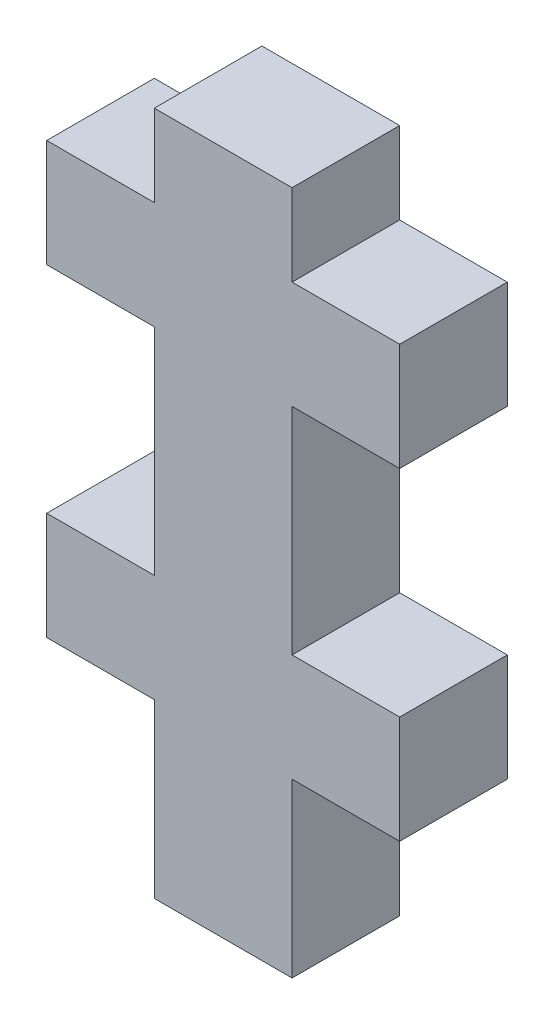
ISO-10303-21;
HEADER;
FILE_DESCRIPTION(('STEP AP214'),'2;1');
FILE_NAME('part.step','',(''),(''),'','','');
FILE_SCHEMA(('AUTOMOTIVE_DESIGN { 1 0 10303 214 1 1 1 1 }'));
ENDSEC;
DATA;
#1=APPLICATION_CONTEXT('core data for automotive mechanical design processes');
#2=APPLICATION_PROTOCOL_DEFINITION('international standard','automotive_design',2000,#1);
#3=PRODUCT_CONTEXT('',#1,'mechanical');
#4=PRODUCT('Part','Part','',(#3));
#5=PRODUCT_RELATED_PRODUCT_CATEGORY('part','',(#4));
#6=PRODUCT_DEFINITION_FORMATION('','',#4);
#7=PRODUCT_DEFINITION_CONTEXT('part definition',#1,'design');
#8=PRODUCT_DEFINITION('design','',#6,#7);
#9=PRODUCT_DEFINITION_SHAPE('','',#8);
#10=(LENGTH_UNIT() NAMED_UNIT(*) SI_UNIT(.MILLI.,.METRE.));
#11=(NAMED_UNIT(*) PLANE_ANGLE_UNIT() SI_UNIT($,.RADIAN.));
#12=(NAMED_UNIT(*) SI_UNIT($,.STERADIAN.) SOLID_ANGLE_UNIT());
#13=UNCERTAINTY_MEASURE_WITH_UNIT(LENGTH_MEASURE(1.E-05),#10,'distance_accuracy_value','');
#14=(GEOMETRIC_REPRESENTATION_CONTEXT(3) GLOBAL_UNCERTAINTY_ASSIGNED_CONTEXT((#13)) GLOBAL_UNIT_ASSIGNED_CONTEXT((#10,
#11,#12)) REPRESENTATION_CONTEXT('',''));
#15=CARTESIAN_POINT('',(0.,0.,0.));
#16=DIRECTION('',(0.,0.,1.));
#17=DIRECTION('',(1.,0.,0.));
#18=AXIS2_PLACEMENT_3D('',#15,#16,#17);
#19=CARTESIAN_POINT('',(0.,7.99999999999999,5.));
#20=DIRECTION('',(1.,0.,0.));
#21=DIRECTION('',(0.,0.,-1.));
#22=AXIS2_PLACEMENT_3D('',#19,#20,#21);
#23=PLANE('',#22);
#24=DIRECTION('',(0.,-1.,0.));
#25=VECTOR('',#24,1.);
#26=CARTESIAN_POINT('',(0.,7.99999999999999,0.));
#27=LINE('',#26,#25);
#28=CARTESIAN_POINT('',(0.,7.99999999999999,0.));
#29=VERTEX_POINT('',#28);
#30=CARTESIAN_POINT('',(0.,0.,0.));
#31=VERTEX_POINT('',#30);
#32=EDGE_CURVE('E200',#29,#31,#27,.T.);
#33=ORIENTED_EDGE('',*,*,#32,.T.);
#34=DIRECTION('',(0.,0.,-1.));
#35=VECTOR('',#34,1.);
#36=CARTESIAN_POINT('',(0.,0.,5.));
#37=LINE('',#36,#35);
#38=CARTESIAN_POINT('',(0.,0.,5.));
#39=VERTEX_POINT('',#38);
#40=EDGE_CURVE('E11',#39,#31,#37,.T.);
#41=ORIENTED_EDGE('',*,*,#40,.F.);
#42=DIRECTION('',(0.,-1.,0.));
#43=VECTOR('',#42,1.);
#44=CARTESIAN_POINT('',(0.,7.99999999999999,5.));
#45=LINE('',#44,#43);
#46=CARTESIAN_POINT('',(0.,7.99999999999999,5.));
#47=VERTEX_POINT('',#46);
#48=EDGE_CURVE('E238',#47,#39,#45,.T.);
#49=ORIENTED_EDGE('',*,*,#48,.F.);
#50=DIRECTION('',(0.,0.,-1.));
#51=VECTOR('',#50,1.);
#52=CARTESIAN_POINT('',(0.,7.99999999999999,5.));
#53=LINE('',#52,#51);
#54=EDGE_CURVE('E196',#47,#29,#53,.T.);
#55=ORIENTED_EDGE('',*,*,#54,.T.);
#56=EDGE_LOOP('',(#33,#41,#49,#55));
#57=FACE_BOUND('',#56,.T.);
#58=ADVANCED_FACE('F32',(#57),#23,.F.);
#59=CARTESIAN_POINT('',(0.,0.,5.));
#60=DIRECTION('',(0.,1.,0.));
#61=DIRECTION('',(0.,0.,1.));
#62=AXIS2_PLACEMENT_3D('',#59,#60,#61);
#63=PLANE('',#62);
#64=DIRECTION('',(1.,0.,0.));
#65=VECTOR('',#64,1.);
#66=CARTESIAN_POINT('',(0.,0.,0.));
#67=LINE('',#66,#65);
#68=CARTESIAN_POINT('',(6.4,0.,0.));
#69=VERTEX_POINT('',#68);
#70=EDGE_CURVE('E203',#31,#69,#67,.T.);
#71=ORIENTED_EDGE('',*,*,#70,.T.);
#72=DIRECTION('',(0.,0.,-1.));
#73=VECTOR('',#72,1.);
#74=CARTESIAN_POINT('',(6.4,0.,5.));
#75=LINE('',#74,#73);
#76=CARTESIAN_POINT('',(6.4,0.,5.));
#77=VERTEX_POINT('',#76);
#78=EDGE_CURVE('E40',#77,#69,#75,.T.);
#79=ORIENTED_EDGE('',*,*,#78,.F.);
#80=DIRECTION('',(1.,0.,0.));
#81=VECTOR('',#80,1.);
#82=CARTESIAN_POINT('',(0.,0.,5.));
#83=LINE('',#82,#81);
#84=EDGE_CURVE('E127',#39,#77,#83,.T.);
#85=ORIENTED_EDGE('',*,*,#84,.F.);
#86=ORIENTED_EDGE('',*,*,#40,.T.);
#87=EDGE_LOOP('',(#71,#79,#85,#86));
#88=FACE_BOUND('',#87,.T.);
#89=ADVANCED_FACE('F356',(#88),#63,.F.);
#90=CARTESIAN_POINT('',(6.4,0.,5.));
#91=DIRECTION('',(-1.,0.,0.));
#92=DIRECTION('',(0.,-1.,0.));
#93=AXIS2_PLACEMENT_3D('',#90,#91,#92);
#94=PLANE('',#93);
#95=DIRECTION('',(0.,1.,0.));
#96=VECTOR('',#95,1.);
#97=CARTESIAN_POINT('',(6.4,0.,0.));
#98=LINE('',#97,#96);
#99=CARTESIAN_POINT('',(6.4,8.00000000000001,0.));
#100=VERTEX_POINT('',#99);
#101=EDGE_CURVE('E205',#69,#100,#98,.T.);
#102=ORIENTED_EDGE('',*,*,#101,.T.);
#103=DIRECTION('',(0.,0.,-1.));
#104=VECTOR('',#103,1.);
#105=CARTESIAN_POINT('',(6.4,8.00000000000001,5.));
#106=LINE('',#105,#104);
#107=CARTESIAN_POINT('',(6.4,8.00000000000001,5.));
#108=VERTEX_POINT('',#107);
#109=EDGE_CURVE('E281',#108,#100,#106,.T.);
#110=ORIENTED_EDGE('',*,*,#109,.F.);
#111=DIRECTION('',(0.,1.,0.));
#112=VECTOR('',#111,1.);
#113=CARTESIAN_POINT('',(6.4,0.,5.));
#114=LINE('',#113,#112);
#115=EDGE_CURVE('E289',#77,#108,#114,.T.);
#116=ORIENTED_EDGE('',*,*,#115,.F.);
#117=ORIENTED_EDGE('',*,*,#78,.T.);
#118=EDGE_LOOP('',(#102,#110,#116,#117));
#119=FACE_BOUND('',#118,.T.);
#120=ADVANCED_FACE('F287',(#119),#94,.F.);
#121=CARTESIAN_POINT('',(11.4,8.00000000000001,5.));
#122=DIRECTION('',(0.,1.,0.));
#123=DIRECTION('',(0.,0.,1.));
#124=AXIS2_PLACEMENT_3D('',#121,#122,#123);
#125=PLANE('',#124);
#126=DIRECTION('',(1.,0.,0.));
#127=VECTOR('',#126,1.);
#128=CARTESIAN_POINT('',(11.4,8.00000000000001,0.));
#129=LINE('',#128,#127);
#130=CARTESIAN_POINT('',(11.4,8.00000000000001,0.));
#131=VERTEX_POINT('',#130);
#132=EDGE_CURVE('E207',#100,#131,#129,.T.);
#133=ORIENTED_EDGE('',*,*,#132,.T.);
#134=DIRECTION('',(0.,0.,-1.));
#135=VECTOR('',#134,1.);
#136=CARTESIAN_POINT('',(11.4,8.00000000000001,5.));
#137=LINE('',#136,#135);
#138=CARTESIAN_POINT('',(11.4,8.00000000000001,5.));
#139=VERTEX_POINT('',#138);
#140=EDGE_CURVE('E278',#139,#131,#137,.T.);
#141=ORIENTED_EDGE('',*,*,#140,.F.);
#142=DIRECTION('',(1.,0.,0.));
#143=VECTOR('',#142,1.);
#144=CARTESIAN_POINT('',(11.4,8.00000000000001,5.));
#145=LINE('',#144,#143);
#146=EDGE_CURVE('E307',#108,#139,#145,.T.);
#147=ORIENTED_EDGE('',*,*,#146,.F.);
#148=ORIENTED_EDGE('',*,*,#109,.T.);
#149=EDGE_LOOP('',(#133,#141,#147,#148));
#150=FACE_BOUND('',#149,.T.);
#151=ADVANCED_FACE('F298',(#150),#125,.F.);
#152=CARTESIAN_POINT('',(11.4,13.,5.));
#153=DIRECTION('',(-1.,0.,0.));
#154=DIRECTION('',(0.,-1.,0.));
#155=AXIS2_PLACEMENT_3D('',#152,#153,#154);
#156=PLANE('',#155);
#157=DIRECTION('',(0.,1.,0.));
#158=VECTOR('',#157,1.);
#159=CARTESIAN_POINT('',(11.4,13.,0.));
#160=LINE('',#159,#158);
#161=CARTESIAN_POINT('',(11.4,13.,0.));
#162=VERTEX_POINT('',#161);
#163=EDGE_CURVE('E209',#131,#162,#160,.T.);
#164=ORIENTED_EDGE('',*,*,#163,.T.);
#165=DIRECTION('',(0.,0.,-1.));
#166=VECTOR('',#165,1.);
#167=CARTESIAN_POINT('',(11.4,13.,5.));
#168=LINE('',#167,#166);
#169=CARTESIAN_POINT('',(11.4,13.,5.));
#170=VERTEX_POINT('',#169);
#171=EDGE_CURVE('E275',#170,#162,#168,.T.);
#172=ORIENTED_EDGE('',*,*,#171,.F.);
#173=DIRECTION('',(0.,1.,0.));
#174=VECTOR('',#173,1.);
#175=CARTESIAN_POINT('',(11.4,13.,5.));
#176=LINE('',#175,#174);
#177=EDGE_CURVE('E304',#139,#170,#176,.T.);
#178=ORIENTED_EDGE('',*,*,#177,.F.);
#179=ORIENTED_EDGE('',*,*,#140,.T.);
#180=EDGE_LOOP('',(#164,#172,#178,#179));
#181=FACE_BOUND('',#180,.T.);
#182=ADVANCED_FACE('F302',(#181),#156,.F.);
#183=CARTESIAN_POINT('',(11.4,13.,5.));
#184=DIRECTION('',(0.,-1.,0.));
#185=DIRECTION('',(1.,0.,0.));
#186=AXIS2_PLACEMENT_3D('',#183,#184,#185);
#187=PLANE('',#186);
#188=DIRECTION('',(-1.,0.,0.));
#189=VECTOR('',#188,1.);
#190=CARTESIAN_POINT('',(11.4,13.,0.));
#191=LINE('',#190,#189);
#192=CARTESIAN_POINT('',(6.4,13.,0.));
#193=VERTEX_POINT('',#192);
#194=EDGE_CURVE('E211',#162,#193,#191,.T.);
#195=ORIENTED_EDGE('',*,*,#194,.T.);
#196=DIRECTION('',(0.,0.,-1.));
#197=VECTOR('',#196,1.);
#198=CARTESIAN_POINT('',(6.4,13.,5.));
#199=LINE('',#198,#197);
#200=CARTESIAN_POINT('',(6.4,13.,5.));
#201=VERTEX_POINT('',#200);
#202=EDGE_CURVE('E272',#201,#193,#199,.T.);
#203=ORIENTED_EDGE('',*,*,#202,.F.);
#204=DIRECTION('',(-1.,0.,0.));
#205=VECTOR('',#204,1.);
#206=CARTESIAN_POINT('',(11.4,13.,5.));
#207=LINE('',#206,#205);
#208=EDGE_CURVE('E306',#170,#201,#207,.T.);
#209=ORIENTED_EDGE('',*,*,#208,.F.);
#210=ORIENTED_EDGE('',*,*,#171,.T.);
#211=EDGE_LOOP('',(#195,#203,#209,#210));
#212=FACE_BOUND('',#211,.T.);
#213=ADVANCED_FACE('F369',(#212),#187,.F.);
#214=CARTESIAN_POINT('',(6.4,23.,5.));
#215=DIRECTION('',(-1.,0.,0.));
#216=DIRECTION('',(0.,-1.,0.));
#217=AXIS2_PLACEMENT_3D('',#214,#215,#216);
#218=PLANE('',#217);
#219=DIRECTION('',(0.,1.,0.));
#220=VECTOR('',#219,1.);
#221=CARTESIAN_POINT('',(6.4,23.,0.));
#222=LINE('',#221,#220);
#223=CARTESIAN_POINT('',(6.4,23.,0.));
#224=VERTEX_POINT('',#223);
#225=EDGE_CURVE('E213',#193,#224,#222,.T.);
#226=ORIENTED_EDGE('',*,*,#225,.T.);
#227=DIRECTION('',(0.,0.,-1.));
#228=VECTOR('',#227,1.);
#229=CARTESIAN_POINT('',(6.4,23.,5.));
#230=LINE('',#229,#228);
#231=CARTESIAN_POINT('',(6.4,23.,5.));
#232=VERTEX_POINT('',#231);
#233=EDGE_CURVE('E269',#232,#224,#230,.T.);
#234=ORIENTED_EDGE('',*,*,#233,.F.);
#235=DIRECTION('',(0.,1.,0.));
#236=VECTOR('',#235,1.);
#237=CARTESIAN_POINT('',(6.4,23.,5.));
#238=LINE('',#237,#236);
#239=EDGE_CURVE('E309',#201,#232,#238,.T.);
#240=ORIENTED_EDGE('',*,*,#239,.F.);
#241=ORIENTED_EDGE('',*,*,#202,.T.);
#242=EDGE_LOOP('',(#226,#234,#240,#241));
#243=FACE_BOUND('',#242,.T.);
#244=ADVANCED_FACE('F372',(#243),#218,.F.);
#245=CARTESIAN_POINT('',(6.4,23.,5.));
#246=DIRECTION('',(0.,1.,0.));
#247=DIRECTION('',(-1.,0.,0.));
#248=AXIS2_PLACEMENT_3D('',#245,#246,#247);
#249=PLANE('',#248);
#250=DIRECTION('',(1.,0.,0.));
#251=VECTOR('',#250,1.);
#252=CARTESIAN_POINT('',(6.4,23.,0.));
#253=LINE('',#252,#251);
#254=CARTESIAN_POINT('',(11.4,23.,0.));
#255=VERTEX_POINT('',#254);
#256=EDGE_CURVE('E215',#224,#255,#253,.T.);
#257=ORIENTED_EDGE('',*,*,#256,.T.);
#258=DIRECTION('',(0.,0.,-1.));
#259=VECTOR('',#258,1.);
#260=CARTESIAN_POINT('',(11.4,23.,5.));
#261=LINE('',#260,#259);
#262=CARTESIAN_POINT('',(11.4,23.,5.));
#263=VERTEX_POINT('',#262);
#264=EDGE_CURVE('E266',#263,#255,#261,.T.);
#265=ORIENTED_EDGE('',*,*,#264,.F.);
#266=DIRECTION('',(1.,0.,0.));
#267=VECTOR('',#266,1.);
#268=CARTESIAN_POINT('',(6.4,23.,5.));
#269=LINE('',#268,#267);
#270=EDGE_CURVE('E315',#232,#263,#269,.T.);
#271=ORIENTED_EDGE('',*,*,#270,.F.);
#272=ORIENTED_EDGE('',*,*,#233,.T.);
#273=EDGE_LOOP('',(#257,#265,#271,#272));
#274=FACE_BOUND('',#273,.T.);
#275=ADVANCED_FACE('F376',(#274),#249,.F.);
#276=CARTESIAN_POINT('',(11.4,23.,5.));
#277=DIRECTION('',(-1.,0.,0.));
#278=DIRECTION('',(0.,-1.,0.));
#279=AXIS2_PLACEMENT_3D('',#276,#277,#278);
#280=PLANE('',#279);
#281=DIRECTION('',(0.,1.,0.));
#282=VECTOR('',#281,1.);
#283=CARTESIAN_POINT('',(11.4,23.,0.));
#284=LINE('',#283,#282);
#285=CARTESIAN_POINT('',(11.4,28.,0.));
#286=VERTEX_POINT('',#285);
#287=EDGE_CURVE('E217',#255,#286,#284,.T.);
#288=ORIENTED_EDGE('',*,*,#287,.T.);
#289=DIRECTION('',(0.,0.,-1.));
#290=VECTOR('',#289,1.);
#291=CARTESIAN_POINT('',(11.4,28.,5.));
#292=LINE('',#291,#290);
#293=CARTESIAN_POINT('',(11.4,28.,5.));
#294=VERTEX_POINT('',#293);
#295=EDGE_CURVE('E263',#294,#286,#292,.T.);
#296=ORIENTED_EDGE('',*,*,#295,.F.);
#297=DIRECTION('',(0.,1.,0.));
#298=VECTOR('',#297,1.);
#299=CARTESIAN_POINT('',(11.4,23.,5.));
#300=LINE('',#299,#298);
#301=EDGE_CURVE('E317',#263,#294,#300,.T.);
#302=ORIENTED_EDGE('',*,*,#301,.F.);
#303=ORIENTED_EDGE('',*,*,#264,.T.);
#304=EDGE_LOOP('',(#288,#296,#302,#303));
#305=FACE_BOUND('',#304,.T.);
#306=ADVANCED_FACE('F380',(#305),#280,.F.);
#307=CARTESIAN_POINT('',(11.4,28.,5.));
#308=DIRECTION('',(0.,-1.,0.));
#309=DIRECTION('',(0.,0.,-1.));
#310=AXIS2_PLACEMENT_3D('',#307,#308,#309);
#311=PLANE('',#310);
#312=DIRECTION('',(-1.,0.,0.));
#313=VECTOR('',#312,1.);
#314=CARTESIAN_POINT('',(11.4,28.,0.));
#315=LINE('',#314,#313);
#316=CARTESIAN_POINT('',(6.4,28.,0.));
#317=VERTEX_POINT('',#316);
#318=EDGE_CURVE('E219',#286,#317,#315,.T.);
#319=ORIENTED_EDGE('',*,*,#318,.T.);
#320=DIRECTION('',(0.,0.,-1.));
#321=VECTOR('',#320,1.);
#322=CARTESIAN_POINT('',(6.4,28.,5.));
#323=LINE('',#322,#321);
#324=CARTESIAN_POINT('',(6.4,28.,5.));
#325=VERTEX_POINT('',#324);
#326=EDGE_CURVE('E260',#325,#317,#323,.T.);
#327=ORIENTED_EDGE('',*,*,#326,.F.);
#328=DIRECTION('',(-1.,0.,0.));
#329=VECTOR('',#328,1.);
#330=CARTESIAN_POINT('',(11.4,28.,5.));
#331=LINE('',#330,#329);
#332=EDGE_CURVE('E319',#294,#325,#331,.T.);
#333=ORIENTED_EDGE('',*,*,#332,.F.);
#334=ORIENTED_EDGE('',*,*,#295,.T.);
#335=EDGE_LOOP('',(#319,#327,#333,#334));
#336=FACE_BOUND('',#335,.T.);
#337=ADVANCED_FACE('F384',(#336),#311,.F.);
#338=CARTESIAN_POINT('',(6.4,28.,5.));
#339=DIRECTION('',(-1.,0.,0.));
#340=DIRECTION('',(0.,-1.,0.));
#341=AXIS2_PLACEMENT_3D('',#338,#339,#340);
#342=PLANE('',#341);
#343=DIRECTION('',(0.,1.,0.));
#344=VECTOR('',#343,1.);
#345=CARTESIAN_POINT('',(6.4,28.,0.));
#346=LINE('',#345,#344);
#347=CARTESIAN_POINT('',(6.4,31.8,0.));
#348=VERTEX_POINT('',#347);
#349=EDGE_CURVE('E221',#317,#348,#346,.T.);
#350=ORIENTED_EDGE('',*,*,#349,.T.);
#351=DIRECTION('',(0.,0.,-1.));
#352=VECTOR('',#351,1.);
#353=CARTESIAN_POINT('',(6.4,31.8,5.));
#354=LINE('',#353,#352);
#355=CARTESIAN_POINT('',(6.4,31.8,5.));
#356=VERTEX_POINT('',#355);
#357=EDGE_CURVE('E257',#356,#348,#354,.T.);
#358=ORIENTED_EDGE('',*,*,#357,.F.);
#359=DIRECTION('',(0.,1.,0.));
#360=VECTOR('',#359,1.);
#361=CARTESIAN_POINT('',(6.4,28.,5.));
#362=LINE('',#361,#360);
#363=EDGE_CURVE('E321',#325,#356,#362,.T.);
#364=ORIENTED_EDGE('',*,*,#363,.F.);
#365=ORIENTED_EDGE('',*,*,#326,.T.);
#366=EDGE_LOOP('',(#350,#358,#364,#365));
#367=FACE_BOUND('',#366,.T.);
#368=ADVANCED_FACE('F388',(#367),#342,.F.);
#369=CARTESIAN_POINT('',(0.,31.8,5.));
#370=DIRECTION('',(0.,-1.,0.));
#371=DIRECTION('',(0.,0.,-1.));
#372=AXIS2_PLACEMENT_3D('',#369,#370,#371);
#373=PLANE('',#372);
#374=DIRECTION('',(-1.,0.,0.));
#375=VECTOR('',#374,1.);
#376=CARTESIAN_POINT('',(0.,31.8,0.));
#377=LINE('',#376,#375);
#378=CARTESIAN_POINT('',(0.,31.8,0.));
#379=VERTEX_POINT('',#378);
#380=EDGE_CURVE('E223',#348,#379,#377,.T.);
#381=ORIENTED_EDGE('',*,*,#380,.T.);
#382=DIRECTION('',(0.,0.,-1.));
#383=VECTOR('',#382,1.);
#384=CARTESIAN_POINT('',(0.,31.8,5.));
#385=LINE('',#384,#383);
#386=CARTESIAN_POINT('',(0.,31.8,5.));
#387=VERTEX_POINT('',#386);
#388=EDGE_CURVE('E254',#387,#379,#385,.T.);
#389=ORIENTED_EDGE('',*,*,#388,.F.);
#390=DIRECTION('',(-1.,0.,0.));
#391=VECTOR('',#390,1.);
#392=CARTESIAN_POINT('',(0.,31.8,5.));
#393=LINE('',#392,#391);
#394=EDGE_CURVE('E323',#356,#387,#393,.T.);
#395=ORIENTED_EDGE('',*,*,#394,.F.);
#396=ORIENTED_EDGE('',*,*,#357,.T.);
#397=EDGE_LOOP('',(#381,#389,#395,#396));
#398=FACE_BOUND('',#397,.T.);
#399=ADVANCED_FACE('F392',(#398),#373,.F.);
#400=CARTESIAN_POINT('',(0.,31.8,5.));
#401=DIRECTION('',(1.,0.,0.));
#402=DIRECTION('',(0.,1.,0.));
#403=AXIS2_PLACEMENT_3D('',#400,#401,#402);
#404=PLANE('',#403);
#405=DIRECTION('',(0.,-1.,0.));
#406=VECTOR('',#405,1.);
#407=CARTESIAN_POINT('',(0.,31.8,0.));
#408=LINE('',#407,#406);
#409=CARTESIAN_POINT('',(0.,28.,0.));
#410=VERTEX_POINT('',#409);
#411=EDGE_CURVE('E225',#379,#410,#408,.T.);
#412=ORIENTED_EDGE('',*,*,#411,.T.);
#413=DIRECTION('',(0.,0.,-1.));
#414=VECTOR('',#413,1.);
#415=CARTESIAN_POINT('',(0.,28.,5.));
#416=LINE('',#415,#414);
#417=CARTESIAN_POINT('',(0.,28.,5.));
#418=VERTEX_POINT('',#417);
#419=EDGE_CURVE('E251',#418,#410,#416,.T.);
#420=ORIENTED_EDGE('',*,*,#419,.F.);
#421=DIRECTION('',(0.,-1.,0.));
#422=VECTOR('',#421,1.);
#423=CARTESIAN_POINT('',(0.,31.8,5.));
#424=LINE('',#423,#422);
#425=EDGE_CURVE('E325',#387,#418,#424,.T.);
#426=ORIENTED_EDGE('',*,*,#425,.F.);
#427=ORIENTED_EDGE('',*,*,#388,.T.);
#428=EDGE_LOOP('',(#412,#420,#426,#427));
#429=FACE_BOUND('',#428,.T.);
#430=ADVANCED_FACE('F396',(#429),#404,.F.);
#431=CARTESIAN_POINT('',(-5.,28.,5.));
#432=DIRECTION('',(0.,-1.,0.));
#433=DIRECTION('',(1.,0.,0.));
#434=AXIS2_PLACEMENT_3D('',#431,#432,#433);
#435=PLANE('',#434);
#436=DIRECTION('',(-1.,0.,0.));
#437=VECTOR('',#436,1.);
#438=CARTESIAN_POINT('',(-5.,28.,0.));
#439=LINE('',#438,#437);
#440=CARTESIAN_POINT('',(-5.,28.,0.));
#441=VERTEX_POINT('',#440);
#442=EDGE_CURVE('E227',#410,#441,#439,.T.);
#443=ORIENTED_EDGE('',*,*,#442,.T.);
#444=DIRECTION('',(0.,0.,-1.));
#445=VECTOR('',#444,1.);
#446=CARTESIAN_POINT('',(-5.,28.,5.));
#447=LINE('',#446,#445);
#448=CARTESIAN_POINT('',(-5.,28.,5.));
#449=VERTEX_POINT('',#448);
#450=EDGE_CURVE('E248',#449,#441,#447,.T.);
#451=ORIENTED_EDGE('',*,*,#450,.F.);
#452=DIRECTION('',(-1.,0.,0.));
#453=VECTOR('',#452,1.);
#454=CARTESIAN_POINT('',(-5.,28.,5.));
#455=LINE('',#454,#453);
#456=EDGE_CURVE('E327',#418,#449,#455,.T.);
#457=ORIENTED_EDGE('',*,*,#456,.F.);
#458=ORIENTED_EDGE('',*,*,#419,.T.);
#459=EDGE_LOOP('',(#443,#451,#457,#458));
#460=FACE_BOUND('',#459,.T.);
#461=ADVANCED_FACE('F400',(#460),#435,.F.);
#462=CARTESIAN_POINT('',(-5.,23.,5.));
#463=DIRECTION('',(1.,0.,0.));
#464=DIRECTION('',(0.,1.,0.));
#465=AXIS2_PLACEMENT_3D('',#462,#463,#464);
#466=PLANE('',#465);
#467=DIRECTION('',(0.,-1.,0.));
#468=VECTOR('',#467,1.);
#469=CARTESIAN_POINT('',(-5.,23.,0.));
#470=LINE('',#469,#468);
#471=CARTESIAN_POINT('',(-5.,23.,0.));
#472=VERTEX_POINT('',#471);
#473=EDGE_CURVE('E229',#441,#472,#470,.T.);
#474=ORIENTED_EDGE('',*,*,#473,.T.);
#475=DIRECTION('',(0.,0.,-1.));
#476=VECTOR('',#475,1.);
#477=CARTESIAN_POINT('',(-5.,23.,5.));
#478=LINE('',#477,#476);
#479=CARTESIAN_POINT('',(-5.,23.,5.));
#480=VERTEX_POINT('',#479);
#481=EDGE_CURVE('E245',#480,#472,#478,.T.);
#482=ORIENTED_EDGE('',*,*,#481,.F.);
#483=DIRECTION('',(0.,-1.,0.));
#484=VECTOR('',#483,1.);
#485=CARTESIAN_POINT('',(-5.,23.,5.));
#486=LINE('',#485,#484);
#487=EDGE_CURVE('E329',#449,#480,#486,.T.);
#488=ORIENTED_EDGE('',*,*,#487,.F.);
#489=ORIENTED_EDGE('',*,*,#450,.T.);
#490=EDGE_LOOP('',(#474,#482,#488,#489));
#491=FACE_BOUND('',#490,.T.);
#492=ADVANCED_FACE('F404',(#491),#466,.F.);
#493=CARTESIAN_POINT('',(-5.,23.,5.));
#494=DIRECTION('',(0.,1.,0.));
#495=DIRECTION('',(0.,0.,1.));
#496=AXIS2_PLACEMENT_3D('',#493,#494,#495);
#497=PLANE('',#496);
#498=DIRECTION('',(1.,0.,0.));
#499=VECTOR('',#498,1.);
#500=CARTESIAN_POINT('',(-5.,23.,0.));
#501=LINE('',#500,#499);
#502=CARTESIAN_POINT('',(0.,23.,0.));
#503=VERTEX_POINT('',#502);
#504=EDGE_CURVE('E231',#472,#503,#501,.T.);
#505=ORIENTED_EDGE('',*,*,#504,.T.);
#506=DIRECTION('',(0.,0.,-1.));
#507=VECTOR('',#506,1.);
#508=CARTESIAN_POINT('',(0.,23.,5.));
#509=LINE('',#508,#507);
#510=CARTESIAN_POINT('',(0.,23.,5.));
#511=VERTEX_POINT('',#510);
#512=EDGE_CURVE('E242',#511,#503,#509,.T.);
#513=ORIENTED_EDGE('',*,*,#512,.F.);
#514=DIRECTION('',(1.,0.,0.));
#515=VECTOR('',#514,1.);
#516=CARTESIAN_POINT('',(-5.,23.,5.));
#517=LINE('',#516,#515);
#518=EDGE_CURVE('E331',#480,#511,#517,.T.);
#519=ORIENTED_EDGE('',*,*,#518,.F.);
#520=ORIENTED_EDGE('',*,*,#481,.T.);
#521=EDGE_LOOP('',(#505,#513,#519,#520));
#522=FACE_BOUND('',#521,.T.);
#523=ADVANCED_FACE('F337',(#522),#497,.F.);
#524=CARTESIAN_POINT('',(0.,13.,5.));
#525=DIRECTION('',(1.,0.,0.));
#526=DIRECTION('',(0.,1.,0.));
#527=AXIS2_PLACEMENT_3D('',#524,#525,#526);
#528=PLANE('',#527);
#529=DIRECTION('',(0.,-1.,0.));
#530=VECTOR('',#529,1.);
#531=CARTESIAN_POINT('',(0.,13.,0.));
#532=LINE('',#531,#530);
#533=CARTESIAN_POINT('',(0.,13.,0.));
#534=VERTEX_POINT('',#533);
#535=EDGE_CURVE('E233',#503,#534,#532,.T.);
#536=ORIENTED_EDGE('',*,*,#535,.T.);
#537=DIRECTION('',(0.,0.,-1.));
#538=VECTOR('',#537,1.);
#539=CARTESIAN_POINT('',(0.,13.,5.));
#540=LINE('',#539,#538);
#541=CARTESIAN_POINT('',(0.,13.,5.));
#542=VERTEX_POINT('',#541);
#543=EDGE_CURVE('E191',#542,#534,#540,.T.);
#544=ORIENTED_EDGE('',*,*,#543,.F.);
#545=DIRECTION('',(0.,-1.,0.));
#546=VECTOR('',#545,1.);
#547=CARTESIAN_POINT('',(0.,13.,5.));
#548=LINE('',#547,#546);
#549=EDGE_CURVE('E182',#511,#542,#548,.T.);
#550=ORIENTED_EDGE('',*,*,#549,.F.);
#551=ORIENTED_EDGE('',*,*,#512,.T.);
#552=EDGE_LOOP('',(#536,#544,#550,#551));
#553=FACE_BOUND('',#552,.T.);
#554=ADVANCED_FACE('F341',(#553),#528,.F.);
#555=CARTESIAN_POINT('',(0.,13.,5.));
#556=DIRECTION('',(0.,-1.,0.));
#557=DIRECTION('',(1.,0.,0.));
#558=AXIS2_PLACEMENT_3D('',#555,#556,#557);
#559=PLANE('',#558);
#560=DIRECTION('',(-1.,0.,0.));
#561=VECTOR('',#560,1.);
#562=CARTESIAN_POINT('',(0.,13.,0.));
#563=LINE('',#562,#561);
#564=CARTESIAN_POINT('',(-5.,13.,0.));
#565=VERTEX_POINT('',#564);
#566=EDGE_CURVE('E190',#534,#565,#563,.T.);
#567=ORIENTED_EDGE('',*,*,#566,.T.);
#568=DIRECTION('',(0.,0.,-1.));
#569=VECTOR('',#568,1.);
#570=CARTESIAN_POINT('',(-5.,13.,5.));
#571=LINE('',#570,#569);
#572=CARTESIAN_POINT('',(-5.,13.,5.));
#573=VERTEX_POINT('',#572);
#574=EDGE_CURVE('E187',#573,#565,#571,.T.);
#575=ORIENTED_EDGE('',*,*,#574,.F.);
#576=DIRECTION('',(-1.,0.,0.));
#577=VECTOR('',#576,1.);
#578=CARTESIAN_POINT('',(0.,13.,5.));
#579=LINE('',#578,#577);
#580=EDGE_CURVE('E176',#542,#573,#579,.T.);
#581=ORIENTED_EDGE('',*,*,#580,.F.);
#582=ORIENTED_EDGE('',*,*,#543,.T.);
#583=EDGE_LOOP('',(#567,#575,#581,#582));
#584=FACE_BOUND('',#583,.T.);
#585=ADVANCED_FACE('F188',(#584),#559,.F.);
#586=CARTESIAN_POINT('',(-5.,13.,5.));
#587=DIRECTION('',(1.,0.,0.));
#588=DIRECTION('',(0.,1.,0.));
#589=AXIS2_PLACEMENT_3D('',#586,#587,#588);
#590=PLANE('',#589);
#591=DIRECTION('',(0.,-1.,0.));
#592=VECTOR('',#591,1.);
#593=CARTESIAN_POINT('',(-5.,13.,0.));
#594=LINE('',#593,#592);
#595=CARTESIAN_POINT('',(-5.,8.,0.));
#596=VERTEX_POINT('',#595);
#597=EDGE_CURVE('E113',#565,#596,#594,.T.);
#598=ORIENTED_EDGE('',*,*,#597,.T.);
#599=DIRECTION('',(0.,0.,-1.));
#600=VECTOR('',#599,1.);
#601=CARTESIAN_POINT('',(-5.,8.,5.));
#602=LINE('',#601,#600);
#603=CARTESIAN_POINT('',(-5.,8.,5.));
#604=VERTEX_POINT('',#603);
#605=EDGE_CURVE('E192',#604,#596,#602,.T.);
#606=ORIENTED_EDGE('',*,*,#605,.F.);
#607=DIRECTION('',(0.,-1.,0.));
#608=VECTOR('',#607,1.);
#609=CARTESIAN_POINT('',(-5.,13.,5.));
#610=LINE('',#609,#608);
#611=EDGE_CURVE('E180',#573,#604,#610,.T.);
#612=ORIENTED_EDGE('',*,*,#611,.F.);
#613=ORIENTED_EDGE('',*,*,#574,.T.);
#614=EDGE_LOOP('',(#598,#606,#612,#613));
#615=FACE_BOUND('',#614,.T.);
#616=ADVANCED_FACE('F194',(#615),#590,.F.);
#617=CARTESIAN_POINT('',(-5.,8.,5.));
#618=DIRECTION('',(0.,1.,0.));
#619=DIRECTION('',(-1.,0.,0.));
#620=AXIS2_PLACEMENT_3D('',#617,#618,#619);
#621=PLANE('',#620);
#622=DIRECTION('',(1.,0.,0.));
#623=VECTOR('',#622,1.);
#624=CARTESIAN_POINT('',(-5.,8.,0.));
#625=LINE('',#624,#623);
#626=EDGE_CURVE('E119',#596,#29,#625,.T.);
#627=ORIENTED_EDGE('',*,*,#626,.T.);
#628=ORIENTED_EDGE('',*,*,#54,.F.);
#629=DIRECTION('',(1.,0.,0.));
#630=VECTOR('',#629,1.);
#631=CARTESIAN_POINT('',(-5.,8.,5.));
#632=LINE('',#631,#630);
#633=EDGE_CURVE('E48',#604,#47,#632,.T.);
#634=ORIENTED_EDGE('',*,*,#633,.F.);
#635=ORIENTED_EDGE('',*,*,#605,.T.);
#636=EDGE_LOOP('',(#627,#628,#634,#635));
#637=FACE_BOUND('',#636,.T.);
#638=ADVANCED_FACE('F345',(#637),#621,.F.);
#639=CARTESIAN_POINT('',(0.,0.,5.));
#640=DIRECTION('',(0.,0.,1.));
#641=DIRECTION('',(1.,0.,0.));
#642=AXIS2_PLACEMENT_3D('',#639,#640,#641);
#643=PLANE('',#642);
#644=ORIENTED_EDGE('',*,*,#48,.T.);
#645=ORIENTED_EDGE('',*,*,#84,.T.);
#646=ORIENTED_EDGE('',*,*,#115,.T.);
#647=ORIENTED_EDGE('',*,*,#146,.T.);
#648=ORIENTED_EDGE('',*,*,#177,.T.);
#649=ORIENTED_EDGE('',*,*,#208,.T.);
#650=ORIENTED_EDGE('',*,*,#239,.T.);
#651=ORIENTED_EDGE('',*,*,#270,.T.);
#652=ORIENTED_EDGE('',*,*,#301,.T.);
#653=ORIENTED_EDGE('',*,*,#332,.T.);
#654=ORIENTED_EDGE('',*,*,#363,.T.);
#655=ORIENTED_EDGE('',*,*,#394,.T.);
#656=ORIENTED_EDGE('',*,*,#425,.T.);
#657=ORIENTED_EDGE('',*,*,#456,.T.);
#658=ORIENTED_EDGE('',*,*,#487,.T.);
#659=ORIENTED_EDGE('',*,*,#518,.T.);
#660=ORIENTED_EDGE('',*,*,#549,.T.);
#661=ORIENTED_EDGE('',*,*,#580,.T.);
#662=ORIENTED_EDGE('',*,*,#611,.T.);
#663=ORIENTED_EDGE('',*,*,#633,.T.);
#664=EDGE_LOOP('',(#644,#645,#646,#647,#648,#649,#650,#651,#652,#653,#654,#655,#656,#657,#658,
#659,#660,#661,#662,#663));
#665=FACE_BOUND('',#664,.T.);
#666=ADVANCED_FACE('F178',(#665),#643,.T.);
#667=CARTESIAN_POINT('',(0.,0.,0.));
#668=DIRECTION('',(0.,0.,1.));
#669=DIRECTION('',(1.,0.,0.));
#670=AXIS2_PLACEMENT_3D('',#667,#668,#669);
#671=PLANE('',#670);
#672=ORIENTED_EDGE('',*,*,#32,.F.);
#673=ORIENTED_EDGE('',*,*,#626,.F.);
#674=ORIENTED_EDGE('',*,*,#597,.F.);
#675=ORIENTED_EDGE('',*,*,#566,.F.);
#676=ORIENTED_EDGE('',*,*,#535,.F.);
#677=ORIENTED_EDGE('',*,*,#504,.F.);
#678=ORIENTED_EDGE('',*,*,#473,.F.);
#679=ORIENTED_EDGE('',*,*,#442,.F.);
#680=ORIENTED_EDGE('',*,*,#411,.F.);
#681=ORIENTED_EDGE('',*,*,#380,.F.);
#682=ORIENTED_EDGE('',*,*,#349,.F.);
#683=ORIENTED_EDGE('',*,*,#318,.F.);
#684=ORIENTED_EDGE('',*,*,#287,.F.);
#685=ORIENTED_EDGE('',*,*,#256,.F.);
#686=ORIENTED_EDGE('',*,*,#225,.F.);
#687=ORIENTED_EDGE('',*,*,#194,.F.);
#688=ORIENTED_EDGE('',*,*,#163,.F.);
#689=ORIENTED_EDGE('',*,*,#132,.F.);
#690=ORIENTED_EDGE('',*,*,#101,.F.);
#691=ORIENTED_EDGE('',*,*,#70,.F.);
#692=EDGE_LOOP('',(#672,#673,#674,#675,#676,#677,#678,#679,#680,#681,#682,#683,#684,#685,#686,
#687,#688,#689,#690,#691));
#693=FACE_BOUND('',#692,.T.);
#694=ADVANCED_FACE('F293',(#693),#671,.F.);
#695=CLOSED_SHELL('',(#58,#89,#120,#151,#182,#213,#244,#275,#306,#337,#368,#399,#430,#461,#492,
#523,#554,#585,#616,#638,#666,#694));
#696=MANIFOLD_SOLID_BREP('B2',#695);
#697=ADVANCED_BREP_SHAPE_REPRESENTATION('',(#18,#696),#14);
#698=SHAPE_DEFINITION_REPRESENTATION(#9,#697);
ENDSEC;
END-ISO-10303-21;
